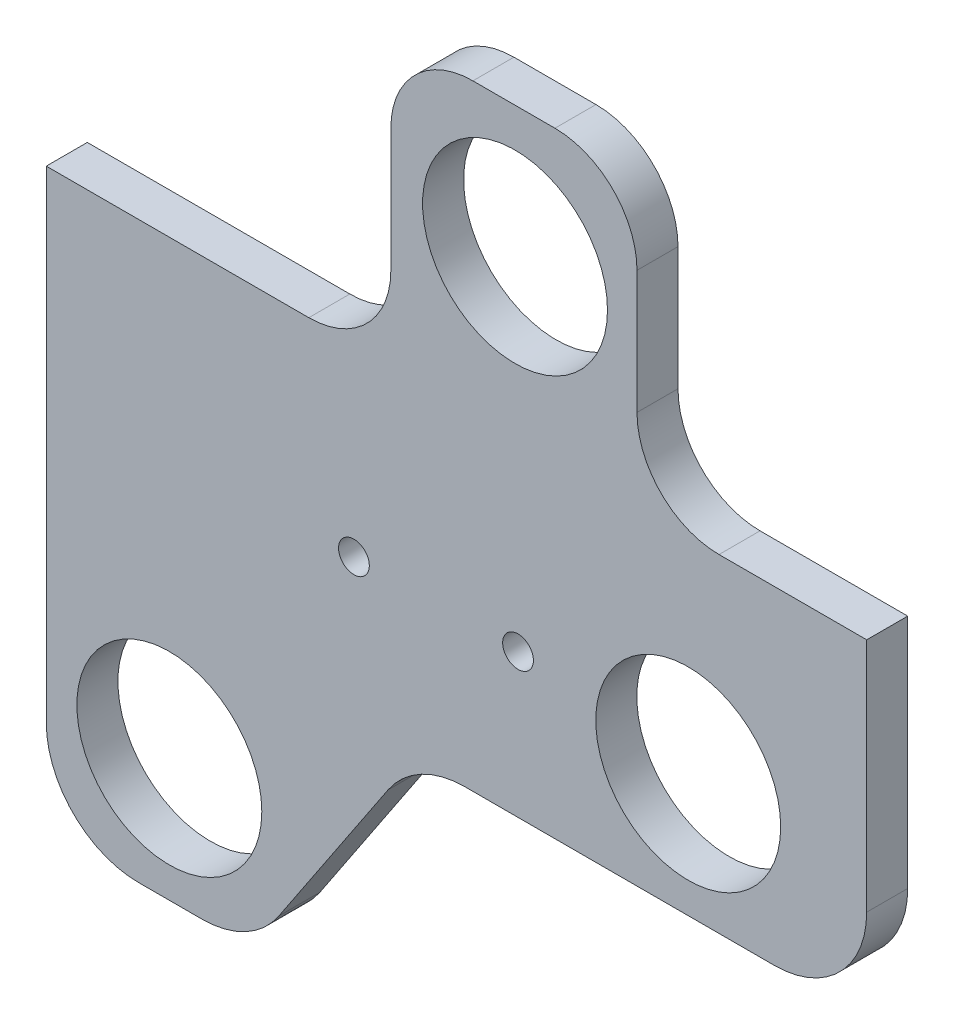
ISO-10303-21;
HEADER;
FILE_DESCRIPTION(('STEP AP214'),'2;1');
FILE_NAME('part.step','',(''),(''),'','','');
FILE_SCHEMA(('AUTOMOTIVE_DESIGN { 1 0 10303 214 1 1 1 1 }'));
ENDSEC;
DATA;
#1=APPLICATION_CONTEXT('core data for automotive mechanical design processes');
#2=APPLICATION_PROTOCOL_DEFINITION('international standard','automotive_design',2000,#1);
#3=PRODUCT_CONTEXT('',#1,'mechanical');
#4=PRODUCT('Part','Part','',(#3));
#5=PRODUCT_RELATED_PRODUCT_CATEGORY('part','',(#4));
#6=PRODUCT_DEFINITION_FORMATION('','',#4);
#7=PRODUCT_DEFINITION_CONTEXT('part definition',#1,'design');
#8=PRODUCT_DEFINITION('design','',#6,#7);
#9=PRODUCT_DEFINITION_SHAPE('','',#8);
#10=(LENGTH_UNIT() NAMED_UNIT(*) SI_UNIT(.MILLI.,.METRE.));
#11=(NAMED_UNIT(*) PLANE_ANGLE_UNIT() SI_UNIT($,.RADIAN.));
#12=(NAMED_UNIT(*) SI_UNIT($,.STERADIAN.) SOLID_ANGLE_UNIT());
#13=UNCERTAINTY_MEASURE_WITH_UNIT(LENGTH_MEASURE(1.E-05),#10,'distance_accuracy_value','');
#14=(GEOMETRIC_REPRESENTATION_CONTEXT(3) GLOBAL_UNCERTAINTY_ASSIGNED_CONTEXT((#13)) GLOBAL_UNIT_ASSIGNED_CONTEXT((#10,
#11,#12)) REPRESENTATION_CONTEXT('',''));
#15=CARTESIAN_POINT('',(0.,0.,0.));
#16=DIRECTION('',(0.,0.,1.));
#17=DIRECTION('',(1.,0.,0.));
#18=AXIS2_PLACEMENT_3D('',#15,#16,#17);
#19=CARTESIAN_POINT('',(0.,44.45,6.35));
#20=DIRECTION('',(0.,1.,0.));
#21=DIRECTION('',(0.,0.,1.));
#22=AXIS2_PLACEMENT_3D('',#19,#20,#21);
#23=PLANE('',#22);
#24=DIRECTION('',(1.,0.,0.));
#25=VECTOR('',#24,1.);
#26=CARTESIAN_POINT('',(0.,44.45,0.));
#27=LINE('',#26,#25);
#28=CARTESIAN_POINT('',(40.64,44.45,0.));
#29=VERTEX_POINT('',#28);
#30=CARTESIAN_POINT('',(63.5,44.45,0.));
#31=VERTEX_POINT('',#30);
#32=EDGE_CURVE('E219',#29,#31,#27,.T.);
#33=ORIENTED_EDGE('',*,*,#32,.F.);
#34=DIRECTION('',(0.,0.,1.));
#35=VECTOR('',#34,1.);
#36=CARTESIAN_POINT('',(40.64,44.45,6.35));
#37=LINE('',#36,#35);
#38=CARTESIAN_POINT('',(40.64,44.45,6.35));
#39=VERTEX_POINT('',#38);
#40=EDGE_CURVE('E170',#29,#39,#37,.T.);
#41=ORIENTED_EDGE('',*,*,#40,.T.);
#42=DIRECTION('',(1.,0.,0.));
#43=VECTOR('',#42,1.);
#44=CARTESIAN_POINT('',(0.,44.45,6.35));
#45=LINE('',#44,#43);
#46=CARTESIAN_POINT('',(63.5,44.45,6.35));
#47=VERTEX_POINT('',#46);
#48=EDGE_CURVE('E165',#39,#47,#45,.T.);
#49=ORIENTED_EDGE('',*,*,#48,.T.);
#50=DIRECTION('',(0.,0.,-1.));
#51=VECTOR('',#50,1.);
#52=CARTESIAN_POINT('',(63.5,44.45,6.35));
#53=LINE('',#52,#51);
#54=EDGE_CURVE('E167',#47,#31,#53,.T.);
#55=ORIENTED_EDGE('',*,*,#54,.T.);
#56=EDGE_LOOP('',(#33,#41,#49,#55));
#57=FACE_BOUND('',#56,.T.);
#58=ADVANCED_FACE('F39',(#57),#23,.T.);
#59=CARTESIAN_POINT('',(-1.46538461538461,0.976923076923073,6.35));
#60=DIRECTION('',(0.832050294337844,-0.554700196225228,0.));
#61=DIRECTION('',(0.554700196225228,0.832050294337844,0.));
#62=AXIS2_PLACEMENT_3D('',#59,#60,#61);
#63=PLANE('',#62);
#64=DIRECTION('',(-0.554700196225228,-0.832050294337844,0.));
#65=VECTOR('',#64,1.);
#66=CARTESIAN_POINT('',(-1.46538461538461,0.976923076923073,0.));
#67=LINE('',#66,#65);
#68=CARTESIAN_POINT('',(-10.5914806309547,-12.712220946432,0.));
#69=VERTEX_POINT('',#68);
#70=CARTESIAN_POINT('',(-27.5085193690452,-38.0877790535679,0.));
#71=VERTEX_POINT('',#70);
#72=EDGE_CURVE('E212',#69,#71,#67,.T.);
#73=ORIENTED_EDGE('',*,*,#72,.F.);
#74=DIRECTION('',(0.,0.,-1.));
#75=VECTOR('',#74,1.);
#76=CARTESIAN_POINT('',(-10.5914806309547,-12.712220946432,6.35));
#77=LINE('',#76,#75);
#78=CARTESIAN_POINT('',(-10.5914806309547,-12.712220946432,6.35));
#79=VERTEX_POINT('',#78);
#80=EDGE_CURVE('E251',#69,#79,#77,.F.);
#81=ORIENTED_EDGE('',*,*,#80,.T.);
#82=DIRECTION('',(-0.554700196225228,-0.832050294337844,0.));
#83=VECTOR('',#82,1.);
#84=CARTESIAN_POINT('',(-1.46538461538461,0.976923076923073,6.35));
#85=LINE('',#84,#83);
#86=CARTESIAN_POINT('',(-27.5085193690452,-38.0877790535679,6.35));
#87=VERTEX_POINT('',#86);
#88=EDGE_CURVE('E194',#79,#87,#85,.T.);
#89=ORIENTED_EDGE('',*,*,#88,.T.);
#90=DIRECTION('',(0.,0.,-1.));
#91=VECTOR('',#90,1.);
#92=CARTESIAN_POINT('',(-27.5085193690453,-38.0877790535679,0.));
#93=LINE('',#92,#91);
#94=EDGE_CURVE('E248',#87,#71,#93,.T.);
#95=ORIENTED_EDGE('',*,*,#94,.T.);
#96=EDGE_LOOP('',(#73,#81,#89,#95));
#97=FACE_BOUND('',#96,.T.);
#98=ADVANCED_FACE('F337',(#97),#63,.T.);
#99=CARTESIAN_POINT('',(0.,-6.34999999999999,6.35));
#100=DIRECTION('',(0.,-1.,0.));
#101=DIRECTION('',(1.,0.,0.));
#102=AXIS2_PLACEMENT_3D('',#99,#100,#101);
#103=PLANE('',#102);
#104=DIRECTION('',(-1.,0.,0.));
#105=VECTOR('',#104,1.);
#106=CARTESIAN_POINT('',(0.,-6.34999999999999,0.));
#107=LINE('',#106,#105);
#108=CARTESIAN_POINT('',(49.2125,-6.34999999999999,0.));
#109=VERTEX_POINT('',#108);
#110=CARTESIAN_POINT('',(1.29643794939727,-6.34999999999999,0.));
#111=VERTEX_POINT('',#110);
#112=EDGE_CURVE('E215',#109,#111,#107,.T.);
#113=ORIENTED_EDGE('',*,*,#112,.F.);
#114=DIRECTION('',(0.,0.,-1.));
#115=VECTOR('',#114,1.);
#116=CARTESIAN_POINT('',(49.2125,-6.34999999999999,6.35));
#117=LINE('',#116,#115);
#118=CARTESIAN_POINT('',(49.2125,-6.34999999999999,6.35));
#119=VERTEX_POINT('',#118);
#120=EDGE_CURVE('E241',#109,#119,#117,.F.);
#121=ORIENTED_EDGE('',*,*,#120,.T.);
#122=DIRECTION('',(-1.,0.,0.));
#123=VECTOR('',#122,1.);
#124=CARTESIAN_POINT('',(0.,-6.34999999999999,6.35));
#125=LINE('',#124,#123);
#126=CARTESIAN_POINT('',(1.29643794939727,-6.34999999999999,6.35));
#127=VERTEX_POINT('',#126);
#128=EDGE_CURVE('E191',#119,#127,#125,.T.);
#129=ORIENTED_EDGE('',*,*,#128,.T.);
#130=DIRECTION('',(0.,0.,-1.));
#131=VECTOR('',#130,1.);
#132=CARTESIAN_POINT('',(1.29643794939727,-6.34999999999999,0.));
#133=LINE('',#132,#131);
#134=EDGE_CURVE('E238',#127,#111,#133,.T.);
#135=ORIENTED_EDGE('',*,*,#134,.T.);
#136=EDGE_LOOP('',(#113,#121,#129,#135));
#137=FACE_BOUND('',#136,.T.);
#138=ADVANCED_FACE('F371',(#137),#103,.T.);
#139=CARTESIAN_POINT('',(63.5,0.,6.35));
#140=DIRECTION('',(1.,0.,0.));
#141=DIRECTION('',(0.,0.,-1.));
#142=AXIS2_PLACEMENT_3D('',#139,#140,#141);
#143=PLANE('',#142);
#144=DIRECTION('',(0.,-1.,0.));
#145=VECTOR('',#144,1.);
#146=CARTESIAN_POINT('',(63.5,0.,6.35));
#147=LINE('',#146,#145);
#148=CARTESIAN_POINT('',(63.5,7.93750000000001,6.35));
#149=VERTEX_POINT('',#148);
#150=EDGE_CURVE('E174',#47,#149,#147,.T.);
#151=ORIENTED_EDGE('',*,*,#150,.T.);
#152=DIRECTION('',(0.,0.,-1.));
#153=VECTOR('',#152,1.);
#154=CARTESIAN_POINT('',(63.5,7.93750000000001,6.35));
#155=LINE('',#154,#153);
#156=CARTESIAN_POINT('',(63.5,7.93750000000001,0.));
#157=VERTEX_POINT('',#156);
#158=EDGE_CURVE('E183',#149,#157,#155,.T.);
#159=ORIENTED_EDGE('',*,*,#158,.T.);
#160=DIRECTION('',(0.,-1.,0.));
#161=VECTOR('',#160,1.);
#162=CARTESIAN_POINT('',(63.5,0.,0.));
#163=LINE('',#162,#161);
#164=EDGE_CURVE('E182',#31,#157,#163,.T.);
#165=ORIENTED_EDGE('',*,*,#164,.F.);
#166=ORIENTED_EDGE('',*,*,#54,.F.);
#167=EDGE_LOOP('',(#151,#159,#165,#166));
#168=FACE_BOUND('',#167,.T.);
#169=ADVANCED_FACE('F178',(#168),#143,.T.);
#170=CARTESIAN_POINT('',(-63.5,44.45,6.35));
#171=VERTEX_POINT('',#170);
#172=CARTESIAN_POINT('',(-22.86,44.45,6.35));
#173=VERTEX_POINT('',#172);
#174=EDGE_CURVE('E173',#171,#173,#45,.T.);
#175=ORIENTED_EDGE('',*,*,#174,.T.);
#176=DIRECTION('',(0.,0.,1.));
#177=VECTOR('',#176,1.);
#178=CARTESIAN_POINT('',(-22.86,44.45,0.));
#179=LINE('',#178,#177);
#180=CARTESIAN_POINT('',(-22.86,44.45,0.));
#181=VERTEX_POINT('',#180);
#182=EDGE_CURVE('E287',#173,#181,#179,.F.);
#183=ORIENTED_EDGE('',*,*,#182,.T.);
#184=CARTESIAN_POINT('',(-63.5,44.45,0.));
#185=VERTEX_POINT('',#184);
#186=EDGE_CURVE('E220',#185,#181,#27,.T.);
#187=ORIENTED_EDGE('',*,*,#186,.F.);
#188=DIRECTION('',(0.,0.,-1.));
#189=VECTOR('',#188,1.);
#190=CARTESIAN_POINT('',(-63.5,44.45,6.35));
#191=LINE('',#190,#189);
#192=EDGE_CURVE('E184',#171,#185,#191,.T.);
#193=ORIENTED_EDGE('',*,*,#192,.F.);
#194=EDGE_LOOP('',(#175,#183,#187,#193));
#195=FACE_BOUND('',#194,.T.);
#196=ADVANCED_FACE('F299',(#195),#23,.T.);
#197=CARTESIAN_POINT('',(-63.5,0.,6.35));
#198=DIRECTION('',(1.,0.,0.));
#199=DIRECTION('',(0.,1.,0.));
#200=AXIS2_PLACEMENT_3D('',#197,#198,#199);
#201=PLANE('',#200);
#202=DIRECTION('',(0.,-1.,0.));
#203=VECTOR('',#202,1.);
#204=CARTESIAN_POINT('',(-63.5,0.,0.));
#205=LINE('',#204,#203);
#206=CARTESIAN_POINT('',(-63.4999999999999,-30.1625,0.));
#207=VERTEX_POINT('',#206);
#208=EDGE_CURVE('E223',#185,#207,#205,.T.);
#209=ORIENTED_EDGE('',*,*,#208,.T.);
#210=DIRECTION('',(0.,0.,-1.));
#211=VECTOR('',#210,1.);
#212=CARTESIAN_POINT('',(-63.4999999999999,-30.1625,6.35));
#213=LINE('',#212,#211);
#214=CARTESIAN_POINT('',(-63.4999999999999,-30.1625,6.35));
#215=VERTEX_POINT('',#214);
#216=EDGE_CURVE('E258',#207,#215,#213,.F.);
#217=ORIENTED_EDGE('',*,*,#216,.T.);
#218=DIRECTION('',(0.,-1.,0.));
#219=VECTOR('',#218,1.);
#220=CARTESIAN_POINT('',(-63.5,0.,6.35));
#221=LINE('',#220,#219);
#222=EDGE_CURVE('E199',#171,#215,#221,.T.);
#223=ORIENTED_EDGE('',*,*,#222,.F.);
#224=ORIENTED_EDGE('',*,*,#192,.T.);
#225=EDGE_LOOP('',(#209,#217,#223,#224));
#226=FACE_BOUND('',#225,.T.);
#227=ADVANCED_FACE('F354',(#226),#201,.F.);
#228=CARTESIAN_POINT('',(-44.45,-25.4,6.35));
#229=DIRECTION('',(0.,0.,-1.));
#230=DIRECTION('',(-1.,0.,0.));
#231=AXIS2_PLACEMENT_3D('',#228,#229,#230);
#232=CYLINDRICAL_SURFACE('',#231,14.3129);
#233=CARTESIAN_POINT('',(-44.45,-25.4,6.35));
#234=DIRECTION('',(0.,0.,1.));
#235=DIRECTION('',(1.,0.,0.));
#236=AXIS2_PLACEMENT_3D('',#233,#234,#235);
#237=CIRCLE('',#236,14.3129);
#238=CARTESIAN_POINT('',(-30.1371,-25.4,6.35));
#239=VERTEX_POINT('',#238);
#240=EDGE_CURVE('E330',#239,#239,#237,.T.);
#241=ORIENTED_EDGE('',*,*,#240,.T.);
#242=EDGE_LOOP('',(#241));
#243=FACE_BOUND('',#242,.T.);
#244=CARTESIAN_POINT('',(-44.45,-25.4,0.));
#245=DIRECTION('',(0.,0.,1.));
#246=DIRECTION('',(1.,0.,0.));
#247=AXIS2_PLACEMENT_3D('',#244,#245,#246);
#248=CIRCLE('',#247,14.3129);
#249=CARTESIAN_POINT('',(-30.1371,-25.4,0.));
#250=VERTEX_POINT('',#249);
#251=EDGE_CURVE('E208',#250,#250,#248,.T.);
#252=ORIENTED_EDGE('',*,*,#251,.F.);
#253=EDGE_LOOP('',(#252));
#254=FACE_BOUND('',#253,.T.);
#255=ADVANCED_FACE('F356',(#243,#254),#232,.F.);
#256=CARTESIAN_POINT('',(35.8718525682768,12.7,6.35));
#257=DIRECTION('',(0.,0.,-1.));
#258=DIRECTION('',(-1.,0.,0.));
#259=AXIS2_PLACEMENT_3D('',#256,#257,#258);
#260=CYLINDRICAL_SURFACE('',#259,14.3129);
#261=CARTESIAN_POINT('',(35.8718525682768,12.7,6.35));
#262=DIRECTION('',(0.,0.,1.));
#263=DIRECTION('',(1.,0.,0.));
#264=AXIS2_PLACEMENT_3D('',#261,#262,#263);
#265=CIRCLE('',#264,14.3129);
#266=CARTESIAN_POINT('',(50.1847525682768,12.7,6.35));
#267=VERTEX_POINT('',#266);
#268=EDGE_CURVE('E229',#267,#267,#265,.T.);
#269=ORIENTED_EDGE('',*,*,#268,.T.);
#270=EDGE_LOOP('',(#269));
#271=FACE_BOUND('',#270,.T.);
#272=CARTESIAN_POINT('',(35.8718525682768,12.7,0.));
#273=DIRECTION('',(0.,0.,1.));
#274=DIRECTION('',(1.,0.,0.));
#275=AXIS2_PLACEMENT_3D('',#272,#273,#274);
#276=CIRCLE('',#275,14.3129);
#277=CARTESIAN_POINT('',(50.1847525682768,12.7,0.));
#278=VERTEX_POINT('',#277);
#279=EDGE_CURVE('E205',#278,#278,#276,.T.);
#280=ORIENTED_EDGE('',*,*,#279,.F.);
#281=EDGE_LOOP('',(#280));
#282=FACE_BOUND('',#281,.T.);
#283=ADVANCED_FACE('F362',(#271,#282),#260,.F.);
#284=CARTESIAN_POINT('',(0.,-44.45,6.35));
#285=DIRECTION('',(0.,1.,0.));
#286=DIRECTION('',(0.,0.,1.));
#287=AXIS2_PLACEMENT_3D('',#284,#285,#286);
#288=PLANE('',#287);
#289=DIRECTION('',(1.,0.,0.));
#290=VECTOR('',#289,1.);
#291=CARTESIAN_POINT('',(0.,-44.45,0.));
#292=LINE('',#291,#290);
#293=CARTESIAN_POINT('',(-49.2124999999999,-44.45,0.));
#294=VERTEX_POINT('',#293);
#295=CARTESIAN_POINT('',(-39.3964379493972,-44.45,0.));
#296=VERTEX_POINT('',#295);
#297=EDGE_CURVE('E226',#294,#296,#292,.T.);
#298=ORIENTED_EDGE('',*,*,#297,.T.);
#299=DIRECTION('',(0.,0.,-1.));
#300=VECTOR('',#299,1.);
#301=CARTESIAN_POINT('',(-39.3964379493972,-44.45,6.35));
#302=LINE('',#301,#300);
#303=CARTESIAN_POINT('',(-39.3964379493972,-44.45,6.35));
#304=VERTEX_POINT('',#303);
#305=EDGE_CURVE('E256',#296,#304,#302,.F.);
#306=ORIENTED_EDGE('',*,*,#305,.T.);
#307=DIRECTION('',(1.,0.,0.));
#308=VECTOR('',#307,1.);
#309=CARTESIAN_POINT('',(0.,-44.45,6.35));
#310=LINE('',#309,#308);
#311=CARTESIAN_POINT('',(-49.2124999999999,-44.45,6.35));
#312=VERTEX_POINT('',#311);
#313=EDGE_CURVE('E202',#312,#304,#310,.T.);
#314=ORIENTED_EDGE('',*,*,#313,.F.);
#315=DIRECTION('',(0.,0.,-1.));
#316=VECTOR('',#315,1.);
#317=CARTESIAN_POINT('',(-49.2124999999999,-44.45,6.35));
#318=LINE('',#317,#316);
#319=EDGE_CURVE('E253',#312,#294,#318,.T.);
#320=ORIENTED_EDGE('',*,*,#319,.T.);
#321=EDGE_LOOP('',(#298,#306,#314,#320));
#322=FACE_BOUND('',#321,.T.);
#323=ADVANCED_FACE('F346',(#322),#288,.F.);
#324=CARTESIAN_POINT('',(0.,0.,6.35));
#325=DIRECTION('',(0.,0.,1.));
#326=DIRECTION('',(1.,0.,0.));
#327=AXIS2_PLACEMENT_3D('',#324,#325,#326);
#328=PLANE('',#327);
#329=CARTESIAN_POINT('',(-15.875,15.875,6.35));
#330=DIRECTION('',(0.,0.,1.));
#331=DIRECTION('',(1.,0.,0.));
#332=AXIS2_PLACEMENT_3D('',#329,#330,#331);
#333=CIRCLE('',#332,2.38125);
#334=CARTESIAN_POINT('',(-13.49375,15.875,6.35));
#335=VERTEX_POINT('',#334);
#336=EDGE_CURVE('E650',#335,#335,#333,.T.);
#337=ORIENTED_EDGE('',*,*,#336,.F.);
#338=EDGE_LOOP('',(#337));
#339=FACE_BOUND('',#338,.T.);
#340=CARTESIAN_POINT('',(9.525,15.875,6.35));
#341=DIRECTION('',(0.,0.,1.));
#342=DIRECTION('',(1.,0.,0.));
#343=AXIS2_PLACEMENT_3D('',#340,#341,#342);
#344=CIRCLE('',#343,2.38125);
#345=CARTESIAN_POINT('',(11.90625,15.875,6.35));
#346=VERTEX_POINT('',#345);
#347=EDGE_CURVE('E654',#346,#346,#344,.T.);
#348=ORIENTED_EDGE('',*,*,#347,.F.);
#349=EDGE_LOOP('',(#348));
#350=FACE_BOUND('',#349,.T.);
#351=CARTESIAN_POINT('',(9.06296763677788,68.577618638679,6.35));
#352=DIRECTION('',(0.,0.,1.));
#353=DIRECTION('',(1.,0.,0.));
#354=AXIS2_PLACEMENT_3D('',#351,#352,#353);
#355=CIRCLE('',#354,14.3129);
#356=CARTESIAN_POINT('',(23.3758676367779,68.577618638679,6.35));
#357=VERTEX_POINT('',#356);
#358=EDGE_CURVE('E319',#357,#357,#355,.T.);
#359=ORIENTED_EDGE('',*,*,#358,.F.);
#360=EDGE_LOOP('',(#359));
#361=FACE_BOUND('',#360,.T.);
#362=ORIENTED_EDGE('',*,*,#268,.F.);
#363=EDGE_LOOP('',(#362));
#364=FACE_BOUND('',#363,.T.);
#365=ORIENTED_EDGE('',*,*,#240,.F.);
#366=EDGE_LOOP('',(#365));
#367=FACE_BOUND('',#366,.T.);
#368=DIRECTION('',(-1.,0.,0.));
#369=VECTOR('',#368,1.);
#370=CARTESIAN_POINT('',(-10.16,88.9,6.35));
#371=LINE('',#370,#369);
#372=CARTESIAN_POINT('',(15.24,88.9,6.35));
#373=VERTEX_POINT('',#372);
#374=CARTESIAN_POINT('',(2.54000000000002,88.9,6.35));
#375=VERTEX_POINT('',#374);
#376=EDGE_CURVE('E313',#373,#375,#371,.T.);
#377=ORIENTED_EDGE('',*,*,#376,.T.);
#378=CARTESIAN_POINT('',(2.54000000000003,76.2,6.35));
#379=DIRECTION('',(0.,0.,1.));
#380=DIRECTION('',(1.,0.,0.));
#381=AXIS2_PLACEMENT_3D('',#378,#379,#380);
#382=CIRCLE('',#381,12.7);
#383=CARTESIAN_POINT('',(-10.16,76.2,6.35));
#384=VERTEX_POINT('',#383);
#385=EDGE_CURVE('E271',#375,#384,#382,.T.);
#386=ORIENTED_EDGE('',*,*,#385,.T.);
#387=DIRECTION('',(0.,-1.,0.));
#388=VECTOR('',#387,1.);
#389=CARTESIAN_POINT('',(-10.16,44.45,6.35));
#390=LINE('',#389,#388);
#391=CARTESIAN_POINT('',(-10.16,57.15,6.35));
#392=VERTEX_POINT('',#391);
#393=EDGE_CURVE('E294',#384,#392,#390,.T.);
#394=ORIENTED_EDGE('',*,*,#393,.T.);
#395=CARTESIAN_POINT('',(-22.86,57.15,6.35));
#396=DIRECTION('',(0.,0.,1.));
#397=DIRECTION('',(1.,0.,0.));
#398=AXIS2_PLACEMENT_3D('',#395,#396,#397);
#399=CIRCLE('',#398,12.7);
#400=EDGE_CURVE('E47',#392,#173,#399,.F.);
#401=ORIENTED_EDGE('',*,*,#400,.T.);
#402=ORIENTED_EDGE('',*,*,#174,.F.);
#403=ORIENTED_EDGE('',*,*,#222,.T.);
#404=CARTESIAN_POINT('',(-49.2124999999999,-30.1625,6.35));
#405=DIRECTION('',(0.,0.,1.));
#406=DIRECTION('',(1.,0.,0.));
#407=AXIS2_PLACEMENT_3D('',#404,#405,#406);
#408=CIRCLE('',#407,14.2875);
#409=EDGE_CURVE('E243',#215,#312,#408,.T.);
#410=ORIENTED_EDGE('',*,*,#409,.T.);
#411=ORIENTED_EDGE('',*,*,#313,.T.);
#412=CARTESIAN_POINT('',(-39.3964379493972,-30.1625,6.35));
#413=DIRECTION('',(0.,0.,1.));
#414=DIRECTION('',(1.,0.,0.));
#415=AXIS2_PLACEMENT_3D('',#412,#413,#414);
#416=CIRCLE('',#415,14.2875);
#417=EDGE_CURVE('E245',#304,#87,#416,.T.);
#418=ORIENTED_EDGE('',*,*,#417,.T.);
#419=ORIENTED_EDGE('',*,*,#88,.F.);
#420=CARTESIAN_POINT('',(1.29643794939727,-20.6375,6.35));
#421=DIRECTION('',(0.,0.,1.));
#422=DIRECTION('',(1.,0.,0.));
#423=AXIS2_PLACEMENT_3D('',#420,#421,#422);
#424=CIRCLE('',#423,14.2875);
#425=EDGE_CURVE('E262',#79,#127,#424,.F.);
#426=ORIENTED_EDGE('',*,*,#425,.T.);
#427=ORIENTED_EDGE('',*,*,#128,.F.);
#428=CARTESIAN_POINT('',(49.2125,7.93750000000001,6.35));
#429=DIRECTION('',(0.,0.,1.));
#430=DIRECTION('',(1.,0.,0.));
#431=AXIS2_PLACEMENT_3D('',#428,#429,#430);
#432=CIRCLE('',#431,14.2875);
#433=EDGE_CURVE('E190',#119,#149,#432,.T.);
#434=ORIENTED_EDGE('',*,*,#433,.T.);
#435=ORIENTED_EDGE('',*,*,#150,.F.);
#436=ORIENTED_EDGE('',*,*,#48,.F.);
#437=CARTESIAN_POINT('',(40.64,57.15,6.35));
#438=DIRECTION('',(0.,0.,1.));
#439=DIRECTION('',(1.,0.,0.));
#440=AXIS2_PLACEMENT_3D('',#437,#438,#439);
#441=CIRCLE('',#440,12.7);
#442=CARTESIAN_POINT('',(27.94,57.15,6.35));
#443=VERTEX_POINT('',#442);
#444=EDGE_CURVE('E289',#39,#443,#441,.F.);
#445=ORIENTED_EDGE('',*,*,#444,.T.);
#446=DIRECTION('',(0.,1.,0.));
#447=VECTOR('',#446,1.);
#448=CARTESIAN_POINT('',(27.94,44.45,6.35));
#449=LINE('',#448,#447);
#450=CARTESIAN_POINT('',(27.94,76.2,6.35));
#451=VERTEX_POINT('',#450);
#452=EDGE_CURVE('E316',#443,#451,#449,.T.);
#453=ORIENTED_EDGE('',*,*,#452,.T.);
#454=CARTESIAN_POINT('',(15.24,76.2,6.35));
#455=DIRECTION('',(0.,0.,1.));
#456=DIRECTION('',(1.,0.,0.));
#457=AXIS2_PLACEMENT_3D('',#454,#455,#456);
#458=CIRCLE('',#457,12.7);
#459=EDGE_CURVE('E269',#451,#373,#458,.T.);
#460=ORIENTED_EDGE('',*,*,#459,.T.);
#461=EDGE_LOOP('',(#377,#386,#394,#401,#402,#403,#410,#411,#418,#419,#426,#427,#434,#435,#436,
#445,#453,#460));
#462=FACE_BOUND('',#461,.T.);
#463=ADVANCED_FACE('F187',(#339,#350,#361,#364,#367,#462),#328,.T.);
#464=CARTESIAN_POINT('',(0.,0.,0.));
#465=DIRECTION('',(0.,0.,1.));
#466=DIRECTION('',(1.,0.,0.));
#467=AXIS2_PLACEMENT_3D('',#464,#465,#466);
#468=PLANE('',#467);
#469=CARTESIAN_POINT('',(-15.875,15.875,0.));
#470=DIRECTION('',(0.,0.,1.));
#471=DIRECTION('',(1.,0.,0.));
#472=AXIS2_PLACEMENT_3D('',#469,#470,#471);
#473=CIRCLE('',#472,2.38125);
#474=CARTESIAN_POINT('',(-13.49375,15.875,0.));
#475=VERTEX_POINT('',#474);
#476=EDGE_CURVE('E648',#475,#475,#473,.T.);
#477=ORIENTED_EDGE('',*,*,#476,.T.);
#478=EDGE_LOOP('',(#477));
#479=FACE_BOUND('',#478,.T.);
#480=CARTESIAN_POINT('',(9.525,15.875,0.));
#481=DIRECTION('',(0.,0.,1.));
#482=DIRECTION('',(1.,0.,0.));
#483=AXIS2_PLACEMENT_3D('',#480,#481,#482);
#484=CIRCLE('',#483,2.38125);
#485=CARTESIAN_POINT('',(11.90625,15.875,0.));
#486=VERTEX_POINT('',#485);
#487=EDGE_CURVE('E659',#486,#486,#484,.T.);
#488=ORIENTED_EDGE('',*,*,#487,.T.);
#489=EDGE_LOOP('',(#488));
#490=FACE_BOUND('',#489,.T.);
#491=CARTESIAN_POINT('',(9.06296763677788,68.577618638679,0.));
#492=DIRECTION('',(0.,0.,1.));
#493=DIRECTION('',(1.,0.,0.));
#494=AXIS2_PLACEMENT_3D('',#491,#492,#493);
#495=CIRCLE('',#494,14.3129);
#496=CARTESIAN_POINT('',(23.3758676367779,68.577618638679,0.));
#497=VERTEX_POINT('',#496);
#498=EDGE_CURVE('E325',#497,#497,#495,.T.);
#499=ORIENTED_EDGE('',*,*,#498,.T.);
#500=EDGE_LOOP('',(#499));
#501=FACE_BOUND('',#500,.T.);
#502=ORIENTED_EDGE('',*,*,#279,.T.);
#503=EDGE_LOOP('',(#502));
#504=FACE_BOUND('',#503,.T.);
#505=ORIENTED_EDGE('',*,*,#251,.T.);
#506=EDGE_LOOP('',(#505));
#507=FACE_BOUND('',#506,.T.);
#508=DIRECTION('',(0.,-1.,0.));
#509=VECTOR('',#508,1.);
#510=CARTESIAN_POINT('',(-10.16,44.45,0.));
#511=LINE('',#510,#509);
#512=CARTESIAN_POINT('',(-10.16,76.2,0.));
#513=VERTEX_POINT('',#512);
#514=CARTESIAN_POINT('',(-10.16,57.15,0.));
#515=VERTEX_POINT('',#514);
#516=EDGE_CURVE('E306',#513,#515,#511,.T.);
#517=ORIENTED_EDGE('',*,*,#516,.F.);
#518=CARTESIAN_POINT('',(2.54000000000003,76.2,0.));
#519=DIRECTION('',(0.,0.,1.));
#520=DIRECTION('',(1.,0.,0.));
#521=AXIS2_PLACEMENT_3D('',#518,#519,#520);
#522=CIRCLE('',#521,12.7);
#523=CARTESIAN_POINT('',(2.54000000000002,88.9,0.));
#524=VERTEX_POINT('',#523);
#525=EDGE_CURVE('E279',#513,#524,#522,.F.);
#526=ORIENTED_EDGE('',*,*,#525,.T.);
#527=DIRECTION('',(-1.,0.,0.));
#528=VECTOR('',#527,1.);
#529=CARTESIAN_POINT('',(-10.16,88.9,0.));
#530=LINE('',#529,#528);
#531=CARTESIAN_POINT('',(15.24,88.9,0.));
#532=VERTEX_POINT('',#531);
#533=EDGE_CURVE('E209',#532,#524,#530,.T.);
#534=ORIENTED_EDGE('',*,*,#533,.F.);
#535=CARTESIAN_POINT('',(15.24,76.2,0.));
#536=DIRECTION('',(0.,0.,1.));
#537=DIRECTION('',(1.,0.,0.));
#538=AXIS2_PLACEMENT_3D('',#535,#536,#537);
#539=CIRCLE('',#538,12.7);
#540=CARTESIAN_POINT('',(27.94,76.2,0.));
#541=VERTEX_POINT('',#540);
#542=EDGE_CURVE('E60',#532,#541,#539,.F.);
#543=ORIENTED_EDGE('',*,*,#542,.T.);
#544=DIRECTION('',(0.,1.,0.));
#545=VECTOR('',#544,1.);
#546=CARTESIAN_POINT('',(27.94,44.45,0.));
#547=LINE('',#546,#545);
#548=CARTESIAN_POINT('',(27.94,57.15,0.));
#549=VERTEX_POINT('',#548);
#550=EDGE_CURVE('E312',#549,#541,#547,.T.);
#551=ORIENTED_EDGE('',*,*,#550,.F.);
#552=CARTESIAN_POINT('',(40.64,57.15,0.));
#553=DIRECTION('',(0.,0.,1.));
#554=DIRECTION('',(1.,0.,0.));
#555=AXIS2_PLACEMENT_3D('',#552,#553,#554);
#556=CIRCLE('',#555,12.7);
#557=EDGE_CURVE('E54',#549,#29,#556,.T.);
#558=ORIENTED_EDGE('',*,*,#557,.T.);
#559=ORIENTED_EDGE('',*,*,#32,.T.);
#560=ORIENTED_EDGE('',*,*,#164,.T.);
#561=CARTESIAN_POINT('',(49.2125,7.93750000000001,0.));
#562=DIRECTION('',(0.,0.,1.));
#563=DIRECTION('',(1.,0.,0.));
#564=AXIS2_PLACEMENT_3D('',#561,#562,#563);
#565=CIRCLE('',#564,14.2875);
#566=EDGE_CURVE('E236',#157,#109,#565,.F.);
#567=ORIENTED_EDGE('',*,*,#566,.T.);
#568=ORIENTED_EDGE('',*,*,#112,.T.);
#569=CARTESIAN_POINT('',(1.29643794939727,-20.6375,0.));
#570=DIRECTION('',(0.,0.,1.));
#571=DIRECTION('',(1.,0.,0.));
#572=AXIS2_PLACEMENT_3D('',#569,#570,#571);
#573=CIRCLE('',#572,14.2875);
#574=EDGE_CURVE('E260',#111,#69,#573,.T.);
#575=ORIENTED_EDGE('',*,*,#574,.T.);
#576=ORIENTED_EDGE('',*,*,#72,.T.);
#577=CARTESIAN_POINT('',(-39.3964379493972,-30.1625,0.));
#578=DIRECTION('',(0.,0.,1.));
#579=DIRECTION('',(1.,0.,0.));
#580=AXIS2_PLACEMENT_3D('',#577,#578,#579);
#581=CIRCLE('',#580,14.2875);
#582=EDGE_CURVE('E234',#71,#296,#581,.F.);
#583=ORIENTED_EDGE('',*,*,#582,.T.);
#584=ORIENTED_EDGE('',*,*,#297,.F.);
#585=CARTESIAN_POINT('',(-49.2124999999999,-30.1625,0.));
#586=DIRECTION('',(0.,0.,1.));
#587=DIRECTION('',(1.,0.,0.));
#588=AXIS2_PLACEMENT_3D('',#585,#586,#587);
#589=CIRCLE('',#588,14.2875);
#590=EDGE_CURVE('E232',#294,#207,#589,.F.);
#591=ORIENTED_EDGE('',*,*,#590,.T.);
#592=ORIENTED_EDGE('',*,*,#208,.F.);
#593=ORIENTED_EDGE('',*,*,#186,.T.);
#594=CARTESIAN_POINT('',(-22.86,57.15,0.));
#595=DIRECTION('',(0.,0.,1.));
#596=DIRECTION('',(1.,0.,0.));
#597=AXIS2_PLACEMENT_3D('',#594,#595,#596);
#598=CIRCLE('',#597,12.7);
#599=EDGE_CURVE('E11',#181,#515,#598,.T.);
#600=ORIENTED_EDGE('',*,*,#599,.T.);
#601=EDGE_LOOP('',(#517,#526,#534,#543,#551,#558,#559,#560,#567,#568,#575,#576,#583,#584,#591,
#592,#593,#600));
#602=FACE_BOUND('',#601,.T.);
#603=ADVANCED_FACE('F305',(#479,#490,#501,#504,#507,#602),#468,.F.);
#604=CARTESIAN_POINT('',(49.2125,7.93750000000001,6.35));
#605=DIRECTION('',(0.,0.,-1.));
#606=DIRECTION('',(-1.,0.,0.));
#607=AXIS2_PLACEMENT_3D('',#604,#605,#606);
#608=CYLINDRICAL_SURFACE('',#607,14.2875);
#609=ORIENTED_EDGE('',*,*,#433,.F.);
#610=ORIENTED_EDGE('',*,*,#120,.F.);
#611=ORIENTED_EDGE('',*,*,#566,.F.);
#612=ORIENTED_EDGE('',*,*,#158,.F.);
#613=EDGE_LOOP('',(#609,#610,#611,#612));
#614=FACE_BOUND('',#613,.T.);
#615=ADVANCED_FACE('F382',(#614),#608,.T.);
#616=CARTESIAN_POINT('',(1.29643794939727,-20.6375,6.35));
#617=DIRECTION('',(0.,0.,1.));
#618=DIRECTION('',(1.,0.,0.));
#619=AXIS2_PLACEMENT_3D('',#616,#617,#618);
#620=CYLINDRICAL_SURFACE('',#619,14.2875);
#621=ORIENTED_EDGE('',*,*,#425,.F.);
#622=ORIENTED_EDGE('',*,*,#80,.F.);
#623=ORIENTED_EDGE('',*,*,#574,.F.);
#624=ORIENTED_EDGE('',*,*,#134,.F.);
#625=EDGE_LOOP('',(#621,#622,#623,#624));
#626=FACE_BOUND('',#625,.T.);
#627=ADVANCED_FACE('F385',(#626),#620,.F.);
#628=CARTESIAN_POINT('',(-39.3964379493972,-30.1625,6.35));
#629=DIRECTION('',(0.,0.,1.));
#630=DIRECTION('',(1.,0.,0.));
#631=AXIS2_PLACEMENT_3D('',#628,#629,#630);
#632=CYLINDRICAL_SURFACE('',#631,14.2875);
#633=ORIENTED_EDGE('',*,*,#417,.F.);
#634=ORIENTED_EDGE('',*,*,#305,.F.);
#635=ORIENTED_EDGE('',*,*,#582,.F.);
#636=ORIENTED_EDGE('',*,*,#94,.F.);
#637=EDGE_LOOP('',(#633,#634,#635,#636));
#638=FACE_BOUND('',#637,.T.);
#639=ADVANCED_FACE('F342',(#638),#632,.T.);
#640=CARTESIAN_POINT('',(-49.2124999999999,-30.1625,6.35));
#641=DIRECTION('',(0.,0.,-1.));
#642=DIRECTION('',(-1.,0.,0.));
#643=AXIS2_PLACEMENT_3D('',#640,#641,#642);
#644=CYLINDRICAL_SURFACE('',#643,14.2875);
#645=ORIENTED_EDGE('',*,*,#409,.F.);
#646=ORIENTED_EDGE('',*,*,#216,.F.);
#647=ORIENTED_EDGE('',*,*,#590,.F.);
#648=ORIENTED_EDGE('',*,*,#319,.F.);
#649=EDGE_LOOP('',(#645,#646,#647,#648));
#650=FACE_BOUND('',#649,.T.);
#651=ADVANCED_FACE('F351',(#650),#644,.T.);
#652=CARTESIAN_POINT('',(-10.16,44.45,0.));
#653=DIRECTION('',(-1.,0.,0.));
#654=DIRECTION('',(0.,0.,1.));
#655=AXIS2_PLACEMENT_3D('',#652,#653,#654);
#656=PLANE('',#655);
#657=ORIENTED_EDGE('',*,*,#393,.F.);
#658=DIRECTION('',(0.,0.,1.));
#659=VECTOR('',#658,1.);
#660=CARTESIAN_POINT('',(-10.16,76.2,0.));
#661=LINE('',#660,#659);
#662=EDGE_CURVE('E276',#384,#513,#661,.F.);
#663=ORIENTED_EDGE('',*,*,#662,.T.);
#664=ORIENTED_EDGE('',*,*,#516,.T.);
#665=DIRECTION('',(0.,0.,1.));
#666=VECTOR('',#665,1.);
#667=CARTESIAN_POINT('',(-10.16,57.15,6.35));
#668=LINE('',#667,#666);
#669=EDGE_CURVE('E273',#515,#392,#668,.T.);
#670=ORIENTED_EDGE('',*,*,#669,.T.);
#671=EDGE_LOOP('',(#657,#663,#664,#670));
#672=FACE_BOUND('',#671,.T.);
#673=ADVANCED_FACE('F310',(#672),#656,.T.);
#674=CARTESIAN_POINT('',(-10.16,88.9,0.));
#675=DIRECTION('',(0.,1.,0.));
#676=DIRECTION('',(0.,0.,1.));
#677=AXIS2_PLACEMENT_3D('',#674,#675,#676);
#678=PLANE('',#677);
#679=ORIENTED_EDGE('',*,*,#533,.T.);
#680=DIRECTION('',(0.,0.,1.));
#681=VECTOR('',#680,1.);
#682=CARTESIAN_POINT('',(2.54000000000003,88.9,0.));
#683=LINE('',#682,#681);
#684=EDGE_CURVE('E266',#524,#375,#683,.T.);
#685=ORIENTED_EDGE('',*,*,#684,.T.);
#686=ORIENTED_EDGE('',*,*,#376,.F.);
#687=DIRECTION('',(0.,0.,1.));
#688=VECTOR('',#687,1.);
#689=CARTESIAN_POINT('',(15.24,88.9,0.));
#690=LINE('',#689,#688);
#691=EDGE_CURVE('E264',#373,#532,#690,.F.);
#692=ORIENTED_EDGE('',*,*,#691,.T.);
#693=EDGE_LOOP('',(#679,#685,#686,#692));
#694=FACE_BOUND('',#693,.T.);
#695=ADVANCED_FACE('F416',(#694),#678,.T.);
#696=CARTESIAN_POINT('',(27.94,44.45,0.));
#697=DIRECTION('',(1.,0.,0.));
#698=DIRECTION('',(0.,0.,-1.));
#699=AXIS2_PLACEMENT_3D('',#696,#697,#698);
#700=PLANE('',#699);
#701=ORIENTED_EDGE('',*,*,#550,.T.);
#702=DIRECTION('',(0.,0.,1.));
#703=VECTOR('',#702,1.);
#704=CARTESIAN_POINT('',(27.94,76.2,0.));
#705=LINE('',#704,#703);
#706=EDGE_CURVE('E283',#541,#451,#705,.T.);
#707=ORIENTED_EDGE('',*,*,#706,.T.);
#708=ORIENTED_EDGE('',*,*,#452,.F.);
#709=DIRECTION('',(0.,0.,1.));
#710=VECTOR('',#709,1.);
#711=CARTESIAN_POINT('',(27.94,57.15,0.));
#712=LINE('',#711,#710);
#713=EDGE_CURVE('E281',#443,#549,#712,.F.);
#714=ORIENTED_EDGE('',*,*,#713,.T.);
#715=EDGE_LOOP('',(#701,#707,#708,#714));
#716=FACE_BOUND('',#715,.T.);
#717=ADVANCED_FACE('F411',(#716),#700,.T.);
#718=CARTESIAN_POINT('',(9.06296763677788,68.577618638679,0.));
#719=DIRECTION('',(0.,0.,1.));
#720=DIRECTION('',(1.,0.,0.));
#721=AXIS2_PLACEMENT_3D('',#718,#719,#720);
#722=CYLINDRICAL_SURFACE('',#721,14.3129);
#723=ORIENTED_EDGE('',*,*,#498,.F.);
#724=EDGE_LOOP('',(#723));
#725=FACE_BOUND('',#724,.T.);
#726=ORIENTED_EDGE('',*,*,#358,.T.);
#727=EDGE_LOOP('',(#726));
#728=FACE_BOUND('',#727,.T.);
#729=ADVANCED_FACE('F424',(#725,#728),#722,.F.);
#730=CARTESIAN_POINT('',(9.525,15.875,0.));
#731=DIRECTION('',(0.,0.,1.));
#732=DIRECTION('',(1.,0.,0.));
#733=AXIS2_PLACEMENT_3D('',#730,#731,#732);
#734=CYLINDRICAL_SURFACE('',#733,2.38125);
#735=ORIENTED_EDGE('',*,*,#487,.F.);
#736=EDGE_LOOP('',(#735));
#737=FACE_BOUND('',#736,.T.);
#738=ORIENTED_EDGE('',*,*,#347,.T.);
#739=EDGE_LOOP('',(#738));
#740=FACE_BOUND('',#739,.T.);
#741=ADVANCED_FACE('F524',(#737,#740),#734,.F.);
#742=CARTESIAN_POINT('',(-15.875,15.875,0.));
#743=DIRECTION('',(0.,0.,1.));
#744=DIRECTION('',(1.,0.,0.));
#745=AXIS2_PLACEMENT_3D('',#742,#743,#744);
#746=CYLINDRICAL_SURFACE('',#745,2.38125);
#747=ORIENTED_EDGE('',*,*,#476,.F.);
#748=EDGE_LOOP('',(#747));
#749=FACE_BOUND('',#748,.T.);
#750=ORIENTED_EDGE('',*,*,#336,.T.);
#751=EDGE_LOOP('',(#750));
#752=FACE_BOUND('',#751,.T.);
#753=ADVANCED_FACE('F398',(#749,#752),#746,.F.);
#754=CARTESIAN_POINT('',(2.54000000000003,76.2,0.));
#755=DIRECTION('',(0.,0.,1.));
#756=DIRECTION('',(1.,0.,0.));
#757=AXIS2_PLACEMENT_3D('',#754,#755,#756);
#758=CYLINDRICAL_SURFACE('',#757,12.7);
#759=ORIENTED_EDGE('',*,*,#525,.F.);
#760=ORIENTED_EDGE('',*,*,#662,.F.);
#761=ORIENTED_EDGE('',*,*,#385,.F.);
#762=ORIENTED_EDGE('',*,*,#684,.F.);
#763=EDGE_LOOP('',(#759,#760,#761,#762));
#764=FACE_BOUND('',#763,.T.);
#765=ADVANCED_FACE('F394',(#764),#758,.T.);
#766=CARTESIAN_POINT('',(15.24,76.2,0.));
#767=DIRECTION('',(0.,0.,1.));
#768=DIRECTION('',(1.,0.,0.));
#769=AXIS2_PLACEMENT_3D('',#766,#767,#768);
#770=CYLINDRICAL_SURFACE('',#769,12.7);
#771=ORIENTED_EDGE('',*,*,#542,.F.);
#772=ORIENTED_EDGE('',*,*,#691,.F.);
#773=ORIENTED_EDGE('',*,*,#459,.F.);
#774=ORIENTED_EDGE('',*,*,#706,.F.);
#775=EDGE_LOOP('',(#771,#772,#773,#774));
#776=FACE_BOUND('',#775,.T.);
#777=ADVANCED_FACE('F397',(#776),#770,.T.);
#778=CARTESIAN_POINT('',(40.64,57.15,6.35));
#779=DIRECTION('',(0.,0.,-1.));
#780=DIRECTION('',(-1.,0.,0.));
#781=AXIS2_PLACEMENT_3D('',#778,#779,#780);
#782=CYLINDRICAL_SURFACE('',#781,12.7);
#783=ORIENTED_EDGE('',*,*,#557,.F.);
#784=ORIENTED_EDGE('',*,*,#713,.F.);
#785=ORIENTED_EDGE('',*,*,#444,.F.);
#786=ORIENTED_EDGE('',*,*,#40,.F.);
#787=EDGE_LOOP('',(#783,#784,#785,#786));
#788=FACE_BOUND('',#787,.T.);
#789=ADVANCED_FACE('F401',(#788),#782,.F.);
#790=CARTESIAN_POINT('',(-22.86,57.15,0.));
#791=DIRECTION('',(0.,0.,-1.));
#792=DIRECTION('',(-1.,0.,0.));
#793=AXIS2_PLACEMENT_3D('',#790,#791,#792);
#794=CYLINDRICAL_SURFACE('',#793,12.7);
#795=ORIENTED_EDGE('',*,*,#599,.F.);
#796=ORIENTED_EDGE('',*,*,#182,.F.);
#797=ORIENTED_EDGE('',*,*,#400,.F.);
#798=ORIENTED_EDGE('',*,*,#669,.F.);
#799=EDGE_LOOP('',(#795,#796,#797,#798));
#800=FACE_BOUND('',#799,.T.);
#801=ADVANCED_FACE('F41',(#800),#794,.F.);
#802=CLOSED_SHELL('',(#58,#98,#138,#169,#196,#227,#255,#283,#323,#463,#603,#615,#627,#639,#651,
#673,#695,#717,#729,#741,#753,#765,#777,#789,#801));
#803=MANIFOLD_SOLID_BREP('B2',#802);
#804=ADVANCED_BREP_SHAPE_REPRESENTATION('',(#18,#803),#14);
#805=SHAPE_DEFINITION_REPRESENTATION(#9,#804);
ENDSEC;
END-ISO-10303-21;
